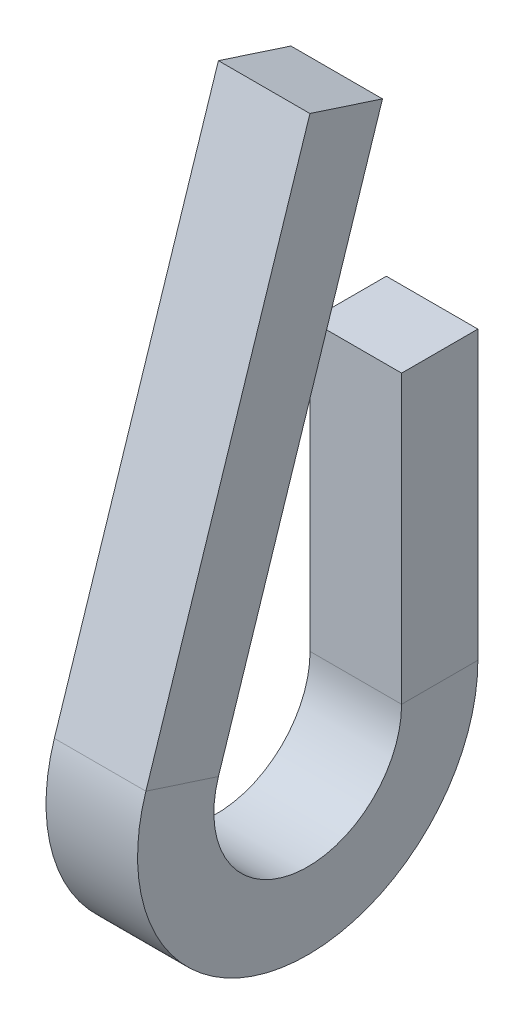
ISO-10303-21;
HEADER;
FILE_DESCRIPTION(('STEP AP214'),'2;1');
FILE_NAME('part.step','',(''),(''),'','','');
FILE_SCHEMA(('AUTOMOTIVE_DESIGN { 1 0 10303 214 1 1 1 1 }'));
ENDSEC;
DATA;
#1=APPLICATION_CONTEXT('core data for automotive mechanical design processes');
#2=APPLICATION_PROTOCOL_DEFINITION('international standard','automotive_design',2000,#1);
#3=PRODUCT_CONTEXT('',#1,'mechanical');
#4=PRODUCT('Part','Part','',(#3));
#5=PRODUCT_RELATED_PRODUCT_CATEGORY('part','',(#4));
#6=PRODUCT_DEFINITION_FORMATION('','',#4);
#7=PRODUCT_DEFINITION_CONTEXT('part definition',#1,'design');
#8=PRODUCT_DEFINITION('design','',#6,#7);
#9=PRODUCT_DEFINITION_SHAPE('','',#8);
#10=(LENGTH_UNIT() NAMED_UNIT(*) SI_UNIT(.MILLI.,.METRE.));
#11=(NAMED_UNIT(*) PLANE_ANGLE_UNIT() SI_UNIT($,.RADIAN.));
#12=(NAMED_UNIT(*) SI_UNIT($,.STERADIAN.) SOLID_ANGLE_UNIT());
#13=UNCERTAINTY_MEASURE_WITH_UNIT(LENGTH_MEASURE(1.E-05),#10,'distance_accuracy_value','');
#14=(GEOMETRIC_REPRESENTATION_CONTEXT(3) GLOBAL_UNCERTAINTY_ASSIGNED_CONTEXT((#13)) GLOBAL_UNIT_ASSIGNED_CONTEXT((#10,
#11,#12)) REPRESENTATION_CONTEXT('',''));
#15=CARTESIAN_POINT('',(0.,0.,0.));
#16=DIRECTION('',(0.,0.,1.));
#17=DIRECTION('',(1.,0.,0.));
#18=AXIS2_PLACEMENT_3D('',#15,#16,#17);
#19=CARTESIAN_POINT('',(0.,0.,0.));
#20=DIRECTION('',(0.,-1.,0.));
#21=DIRECTION('',(0.,0.,-1.));
#22=AXIS2_PLACEMENT_3D('',#19,#20,#21);
#23=PLANE('',#22);
#24=DIRECTION('',(0.,0.,-1.));
#25=VECTOR('',#24,1.);
#26=CARTESIAN_POINT('',(6.,0.,5.));
#27=LINE('',#26,#25);
#28=CARTESIAN_POINT('',(6.,0.,5.));
#29=VERTEX_POINT('',#28);
#30=CARTESIAN_POINT('',(6.,0.,-5.));
#31=VERTEX_POINT('',#30);
#32=EDGE_CURVE('E146',#29,#31,#27,.T.);
#33=ORIENTED_EDGE('',*,*,#32,.T.);
#34=DIRECTION('',(-1.,0.,0.));
#35=VECTOR('',#34,1.);
#36=CARTESIAN_POINT('',(-6.,0.,-5.));
#37=LINE('',#36,#35);
#38=CARTESIAN_POINT('',(-6.,0.,-5.));
#39=VERTEX_POINT('',#38);
#40=EDGE_CURVE('E157',#31,#39,#37,.T.);
#41=ORIENTED_EDGE('',*,*,#40,.T.);
#42=DIRECTION('',(0.,0.,1.));
#43=VECTOR('',#42,1.);
#44=CARTESIAN_POINT('',(-6.,0.,5.));
#45=LINE('',#44,#43);
#46=CARTESIAN_POINT('',(-6.,0.,5.));
#47=VERTEX_POINT('',#46);
#48=EDGE_CURVE('E161',#39,#47,#45,.T.);
#49=ORIENTED_EDGE('',*,*,#48,.T.);
#50=DIRECTION('',(1.,0.,0.));
#51=VECTOR('',#50,1.);
#52=CARTESIAN_POINT('',(-6.,0.,5.));
#53=LINE('',#52,#51);
#54=EDGE_CURVE('E160',#47,#29,#53,.T.);
#55=ORIENTED_EDGE('',*,*,#54,.T.);
#56=EDGE_LOOP('',(#33,#41,#49,#55));
#57=FACE_BOUND('',#56,.T.);
#58=ADVANCED_FACE('F43',(#57),#23,.F.);
#59=CARTESIAN_POINT('',(0.,33.9359199934688,12.2630312393681));
#60=DIRECTION('',(0.,0.951056516295218,-0.309016994374749));
#61=DIRECTION('',(0.,0.309016994374749,0.951056516295218));
#62=AXIS2_PLACEMENT_3D('',#59,#60,#61);
#63=PLANE('',#62);
#64=DIRECTION('',(0.,0.309016994374749,0.951056516295218));
#65=VECTOR('',#64,1.);
#66=CARTESIAN_POINT('',(6.,32.390835021595,7.50774865789199));
#67=LINE('',#66,#65);
#68=CARTESIAN_POINT('',(6.,32.390835021595,7.507748657892));
#69=VERTEX_POINT('',#68);
#70=CARTESIAN_POINT('',(6.,35.4810049653425,17.0183138208442));
#71=VERTEX_POINT('',#70);
#72=EDGE_CURVE('E260',#69,#71,#67,.T.);
#73=ORIENTED_EDGE('',*,*,#72,.F.);
#74=DIRECTION('',(1.,0.,0.));
#75=VECTOR('',#74,1.);
#76=CARTESIAN_POINT('',(-6.,32.390835021595,7.50774865789199));
#77=LINE('',#76,#75);
#78=CARTESIAN_POINT('',(-6.,32.390835021595,7.507748657892));
#79=VERTEX_POINT('',#78);
#80=EDGE_CURVE('E12',#79,#69,#77,.T.);
#81=ORIENTED_EDGE('',*,*,#80,.F.);
#82=DIRECTION('',(0.,-0.309016994374749,-0.951056516295218));
#83=VECTOR('',#82,1.);
#84=CARTESIAN_POINT('',(-6.,32.390835021595,7.50774865789199));
#85=LINE('',#84,#83);
#86=CARTESIAN_POINT('',(-6.,35.4810049653425,17.0183138208442));
#87=VERTEX_POINT('',#86);
#88=EDGE_CURVE('E63',#87,#79,#85,.T.);
#89=ORIENTED_EDGE('',*,*,#88,.F.);
#90=DIRECTION('',(-1.,0.,0.));
#91=VECTOR('',#90,1.);
#92=CARTESIAN_POINT('',(-6.,35.4810049653425,17.0183138208442));
#93=LINE('',#92,#91);
#94=EDGE_CURVE('E73',#71,#87,#93,.T.);
#95=ORIENTED_EDGE('',*,*,#94,.F.);
#96=EDGE_LOOP('',(#73,#81,#89,#95));
#97=FACE_BOUND('',#96,.T.);
#98=ADVANCED_FACE('F300',(#97),#63,.T.);
#99=CARTESIAN_POINT('',(6.,0.,5.));
#100=DIRECTION('',(-1.,0.,0.));
#101=DIRECTION('',(0.,0.,1.));
#102=AXIS2_PLACEMENT_3D('',#99,#100,#101);
#103=PLANE('',#102);
#104=DIRECTION('',(0.,-1.,0.));
#105=VECTOR('',#104,1.);
#106=CARTESIAN_POINT('',(6.,0.,-5.));
#107=LINE('',#106,#105);
#108=CARTESIAN_POINT('',(6.,-37.5978864707488,-5.));
#109=VERTEX_POINT('',#108);
#110=EDGE_CURVE('E153',#31,#109,#107,.T.);
#111=ORIENTED_EDGE('',*,*,#110,.F.);
#112=ORIENTED_EDGE('',*,*,#32,.F.);
#113=DIRECTION('',(0.,-1.,0.));
#114=VECTOR('',#113,1.);
#115=CARTESIAN_POINT('',(6.,0.,5.));
#116=LINE('',#115,#114);
#117=CARTESIAN_POINT('',(6.,-37.5978864707488,5.));
#118=VERTEX_POINT('',#117);
#119=EDGE_CURVE('E151',#29,#118,#116,.T.);
#120=ORIENTED_EDGE('',*,*,#119,.T.);
#121=DIRECTION('',(0.,0.,-1.));
#122=VECTOR('',#121,1.);
#123=CARTESIAN_POINT('',(6.,-37.5978864707488,5.));
#124=LINE('',#123,#122);
#125=EDGE_CURVE('E172',#118,#109,#124,.T.);
#126=ORIENTED_EDGE('',*,*,#125,.T.);
#127=EDGE_LOOP('',(#111,#112,#120,#126));
#128=FACE_BOUND('',#127,.T.);
#129=ADVANCED_FACE('F148',(#128),#103,.F.);
#130=CARTESIAN_POINT('',(-6.,0.,-5.));
#131=DIRECTION('',(0.,0.,1.));
#132=DIRECTION('',(1.,0.,0.));
#133=AXIS2_PLACEMENT_3D('',#130,#131,#132);
#134=PLANE('',#133);
#135=DIRECTION('',(0.,-1.,0.));
#136=VECTOR('',#135,1.);
#137=CARTESIAN_POINT('',(-6.,0.,-5.));
#138=LINE('',#137,#136);
#139=CARTESIAN_POINT('',(-6.,-37.5978864707488,-5.));
#140=VERTEX_POINT('',#139);
#141=EDGE_CURVE('E212',#39,#140,#138,.T.);
#142=ORIENTED_EDGE('',*,*,#141,.F.);
#143=ORIENTED_EDGE('',*,*,#40,.F.);
#144=ORIENTED_EDGE('',*,*,#110,.T.);
#145=DIRECTION('',(-1.,0.,0.));
#146=VECTOR('',#145,1.);
#147=CARTESIAN_POINT('',(-6.,-37.5978864707488,-5.));
#148=LINE('',#147,#146);
#149=EDGE_CURVE('E208',#109,#140,#148,.T.);
#150=ORIENTED_EDGE('',*,*,#149,.T.);
#151=EDGE_LOOP('',(#142,#143,#144,#150));
#152=FACE_BOUND('',#151,.T.);
#153=ADVANCED_FACE('F291',(#152),#134,.F.);
#154=CARTESIAN_POINT('',(-6.,0.,5.));
#155=DIRECTION('',(1.,0.,0.));
#156=DIRECTION('',(0.,0.,-1.));
#157=AXIS2_PLACEMENT_3D('',#154,#155,#156);
#158=PLANE('',#157);
#159=DIRECTION('',(0.,-1.,0.));
#160=VECTOR('',#159,1.);
#161=CARTESIAN_POINT('',(-6.,0.,5.));
#162=LINE('',#161,#160);
#163=CARTESIAN_POINT('',(-6.,-37.5978864707488,5.));
#164=VERTEX_POINT('',#163);
#165=EDGE_CURVE('E220',#47,#164,#162,.T.);
#166=ORIENTED_EDGE('',*,*,#165,.F.);
#167=ORIENTED_EDGE('',*,*,#48,.F.);
#168=ORIENTED_EDGE('',*,*,#141,.T.);
#169=DIRECTION('',(0.,0.,1.));
#170=VECTOR('',#169,1.);
#171=CARTESIAN_POINT('',(-6.,-37.5978864707488,5.));
#172=LINE('',#171,#170);
#173=EDGE_CURVE('E224',#140,#164,#172,.T.);
#174=ORIENTED_EDGE('',*,*,#173,.T.);
#175=EDGE_LOOP('',(#166,#167,#168,#174));
#176=FACE_BOUND('',#175,.T.);
#177=ADVANCED_FACE('F349',(#176),#158,.F.);
#178=CARTESIAN_POINT('',(-6.,0.,5.));
#179=DIRECTION('',(0.,0.,-1.));
#180=DIRECTION('',(-1.,0.,0.));
#181=AXIS2_PLACEMENT_3D('',#178,#179,#180);
#182=PLANE('',#181);
#183=DIRECTION('',(1.,0.,0.));
#184=VECTOR('',#183,1.);
#185=CARTESIAN_POINT('',(-6.,-37.5978864707488,5.));
#186=LINE('',#185,#184);
#187=EDGE_CURVE('E170',#164,#118,#186,.T.);
#188=ORIENTED_EDGE('',*,*,#187,.T.);
#189=ORIENTED_EDGE('',*,*,#119,.F.);
#190=ORIENTED_EDGE('',*,*,#54,.F.);
#191=ORIENTED_EDGE('',*,*,#165,.T.);
#192=EDGE_LOOP('',(#188,#189,#190,#191));
#193=FACE_BOUND('',#192,.T.);
#194=ADVANCED_FACE('F168',(#193),#182,.F.);
#195=CARTESIAN_POINT('',(6.,-37.5978864707488,5.00000000000002));
#196=DIRECTION('',(-1.,0.,0.));
#197=DIRECTION('',(0.,0.,1.));
#198=AXIS2_PLACEMENT_3D('',#195,#196,#197);
#199=PLANE('',#198);
#200=CARTESIAN_POINT('',(6.,-37.5978864707488,17.3075445828761));
#201=DIRECTION('',(-1.,0.,0.));
#202=DIRECTION('',(0.,0.,-1.));
#203=AXIS2_PLACEMENT_3D('',#200,#201,#202);
#204=CIRCLE('',#203,22.3075445828761);
#205=CARTESIAN_POINT('',(6.,-30.7044760918677,38.5232802209665));
#206=VERTEX_POINT('',#205);
#207=EDGE_CURVE('E133',#109,#206,#204,.T.);
#208=ORIENTED_EDGE('',*,*,#207,.F.);
#209=ORIENTED_EDGE('',*,*,#125,.F.);
#210=CARTESIAN_POINT('',(6.,-37.5978864707488,17.3075445828761));
#211=DIRECTION('',(-1.,0.,0.));
#212=DIRECTION('',(0.,0.,-1.));
#213=AXIS2_PLACEMENT_3D('',#210,#211,#212);
#214=CIRCLE('',#213,12.3075445828761);
#215=CARTESIAN_POINT('',(6.,-33.7946460356152,29.0127150580143));
#216=VERTEX_POINT('',#215);
#217=EDGE_CURVE('E247',#118,#216,#214,.T.);
#218=ORIENTED_EDGE('',*,*,#217,.T.);
#219=DIRECTION('',(0.,0.30901699437475,0.951056516295218));
#220=VECTOR('',#219,1.);
#221=CARTESIAN_POINT('',(6.,-33.7946460356152,29.0127150580143));
#222=LINE('',#221,#220);
#223=EDGE_CURVE('E181',#216,#206,#222,.T.);
#224=ORIENTED_EDGE('',*,*,#223,.T.);
#225=EDGE_LOOP('',(#208,#209,#218,#224));
#226=FACE_BOUND('',#225,.T.);
#227=ADVANCED_FACE('F292',(#226),#199,.F.);
#228=CARTESIAN_POINT('',(0.,-37.5978864707488,17.3075445828761));
#229=DIRECTION('',(-1.,0.,0.));
#230=DIRECTION('',(0.,0.,1.));
#231=AXIS2_PLACEMENT_3D('',#228,#229,#230);
#232=CYLINDRICAL_SURFACE('',#231,22.3075445828761);
#233=CARTESIAN_POINT('',(-6.,-37.5978864707488,17.3075445828761));
#234=DIRECTION('',(-1.,0.,0.));
#235=DIRECTION('',(0.,0.,-1.));
#236=AXIS2_PLACEMENT_3D('',#233,#234,#235);
#237=CIRCLE('',#236,22.3075445828761);
#238=CARTESIAN_POINT('',(-6.,-30.7044760918677,38.5232802209665));
#239=VERTEX_POINT('',#238);
#240=EDGE_CURVE('E125',#140,#239,#237,.T.);
#241=ORIENTED_EDGE('',*,*,#240,.F.);
#242=ORIENTED_EDGE('',*,*,#149,.F.);
#243=ORIENTED_EDGE('',*,*,#207,.T.);
#244=DIRECTION('',(-1.,0.,0.));
#245=VECTOR('',#244,1.);
#246=CARTESIAN_POINT('',(-6.,-30.7044760918677,38.5232802209665));
#247=LINE('',#246,#245);
#248=EDGE_CURVE('E255',#206,#239,#247,.T.);
#249=ORIENTED_EDGE('',*,*,#248,.T.);
#250=EDGE_LOOP('',(#241,#242,#243,#249));
#251=FACE_BOUND('',#250,.T.);
#252=ADVANCED_FACE('F302',(#251),#232,.T.);
#253=CARTESIAN_POINT('',(-6.,-37.5978864707488,5.00000000000002));
#254=DIRECTION('',(1.,0.,0.));
#255=DIRECTION('',(0.,0.,-1.));
#256=AXIS2_PLACEMENT_3D('',#253,#254,#255);
#257=PLANE('',#256);
#258=CARTESIAN_POINT('',(-6.,-37.5978864707488,17.3075445828761));
#259=DIRECTION('',(-1.,0.,0.));
#260=DIRECTION('',(0.,0.,-1.));
#261=AXIS2_PLACEMENT_3D('',#258,#259,#260);
#262=CIRCLE('',#261,12.3075445828761);
#263=CARTESIAN_POINT('',(-6.,-33.7946460356152,29.0127150580143));
#264=VERTEX_POINT('',#263);
#265=EDGE_CURVE('E231',#164,#264,#262,.T.);
#266=ORIENTED_EDGE('',*,*,#265,.F.);
#267=ORIENTED_EDGE('',*,*,#173,.F.);
#268=ORIENTED_EDGE('',*,*,#240,.T.);
#269=DIRECTION('',(0.,-0.30901699437475,-0.951056516295218));
#270=VECTOR('',#269,1.);
#271=CARTESIAN_POINT('',(-6.,-33.7946460356152,29.0127150580143));
#272=LINE('',#271,#270);
#273=EDGE_CURVE('E226',#239,#264,#272,.T.);
#274=ORIENTED_EDGE('',*,*,#273,.T.);
#275=EDGE_LOOP('',(#266,#267,#268,#274));
#276=FACE_BOUND('',#275,.T.);
#277=ADVANCED_FACE('F280',(#276),#257,.F.);
#278=CARTESIAN_POINT('',(0.,-37.5978864707488,17.3075445828761));
#279=DIRECTION('',(-1.,0.,0.));
#280=DIRECTION('',(0.,0.,1.));
#281=AXIS2_PLACEMENT_3D('',#278,#279,#280);
#282=CYLINDRICAL_SURFACE('',#281,12.3075445828761);
#283=DIRECTION('',(1.,0.,0.));
#284=VECTOR('',#283,1.);
#285=CARTESIAN_POINT('',(-6.,-33.7946460356152,29.0127150580143));
#286=LINE('',#285,#284);
#287=EDGE_CURVE('E240',#264,#216,#286,.T.);
#288=ORIENTED_EDGE('',*,*,#287,.T.);
#289=ORIENTED_EDGE('',*,*,#217,.F.);
#290=ORIENTED_EDGE('',*,*,#187,.F.);
#291=ORIENTED_EDGE('',*,*,#265,.T.);
#292=EDGE_LOOP('',(#288,#289,#290,#291));
#293=FACE_BOUND('',#292,.T.);
#294=ADVANCED_FACE('F277',(#293),#282,.F.);
#295=CARTESIAN_POINT('',(6.,-33.7946460356152,29.0127150580143));
#296=DIRECTION('',(-1.,0.,0.));
#297=DIRECTION('',(0.,0.,1.));
#298=AXIS2_PLACEMENT_3D('',#295,#296,#297);
#299=PLANE('',#298);
#300=DIRECTION('',(0.,0.951056516295218,-0.309016994374749));
#301=VECTOR('',#300,1.);
#302=CARTESIAN_POINT('',(6.,-30.7044760918677,38.5232802209665));
#303=LINE('',#302,#301);
#304=EDGE_CURVE('E109',#206,#71,#303,.T.);
#305=ORIENTED_EDGE('',*,*,#304,.F.);
#306=ORIENTED_EDGE('',*,*,#223,.F.);
#307=DIRECTION('',(0.,0.951056516295218,-0.309016994374749));
#308=VECTOR('',#307,1.);
#309=CARTESIAN_POINT('',(6.,-33.7946460356152,29.0127150580143));
#310=LINE('',#309,#308);
#311=EDGE_CURVE('E205',#216,#69,#310,.T.);
#312=ORIENTED_EDGE('',*,*,#311,.T.);
#313=ORIENTED_EDGE('',*,*,#72,.T.);
#314=EDGE_LOOP('',(#305,#306,#312,#313));
#315=FACE_BOUND('',#314,.T.);
#316=ADVANCED_FACE('F298',(#315),#299,.F.);
#317=CARTESIAN_POINT('',(-6.,-30.7044760918677,38.5232802209665));
#318=DIRECTION('',(0.,-0.309016994374749,-0.951056516295218));
#319=DIRECTION('',(0.,0.951056516295218,-0.309016994374749));
#320=AXIS2_PLACEMENT_3D('',#317,#318,#319);
#321=PLANE('',#320);
#322=DIRECTION('',(0.,0.951056516295218,-0.309016994374749));
#323=VECTOR('',#322,1.);
#324=CARTESIAN_POINT('',(-6.,-30.7044760918677,38.5232802209665));
#325=LINE('',#324,#323);
#326=EDGE_CURVE('E103',#239,#87,#325,.T.);
#327=ORIENTED_EDGE('',*,*,#326,.F.);
#328=ORIENTED_EDGE('',*,*,#248,.F.);
#329=ORIENTED_EDGE('',*,*,#304,.T.);
#330=ORIENTED_EDGE('',*,*,#94,.T.);
#331=EDGE_LOOP('',(#327,#328,#329,#330));
#332=FACE_BOUND('',#331,.T.);
#333=ADVANCED_FACE('F301',(#332),#321,.F.);
#334=CARTESIAN_POINT('',(-6.,-33.7946460356152,29.0127150580143));
#335=DIRECTION('',(1.,0.,0.));
#336=DIRECTION('',(0.,0.,-1.));
#337=AXIS2_PLACEMENT_3D('',#334,#335,#336);
#338=PLANE('',#337);
#339=DIRECTION('',(0.,0.951056516295218,-0.309016994374749));
#340=VECTOR('',#339,1.);
#341=CARTESIAN_POINT('',(-6.,-33.7946460356152,29.0127150580143));
#342=LINE('',#341,#340);
#343=EDGE_CURVE('E53',#264,#79,#342,.T.);
#344=ORIENTED_EDGE('',*,*,#343,.F.);
#345=ORIENTED_EDGE('',*,*,#273,.F.);
#346=ORIENTED_EDGE('',*,*,#326,.T.);
#347=ORIENTED_EDGE('',*,*,#88,.T.);
#348=EDGE_LOOP('',(#344,#345,#346,#347));
#349=FACE_BOUND('',#348,.T.);
#350=ADVANCED_FACE('F281',(#349),#338,.F.);
#351=CARTESIAN_POINT('',(-6.,-33.7946460356152,29.0127150580143));
#352=DIRECTION('',(0.,0.309016994374749,0.951056516295218));
#353=DIRECTION('',(0.,-0.951056516295218,0.309016994374749));
#354=AXIS2_PLACEMENT_3D('',#351,#352,#353);
#355=PLANE('',#354);
#356=ORIENTED_EDGE('',*,*,#80,.T.);
#357=ORIENTED_EDGE('',*,*,#311,.F.);
#358=ORIENTED_EDGE('',*,*,#287,.F.);
#359=ORIENTED_EDGE('',*,*,#343,.T.);
#360=EDGE_LOOP('',(#356,#357,#358,#359));
#361=FACE_BOUND('',#360,.T.);
#362=ADVANCED_FACE('F272',(#361),#355,.F.);
#363=CLOSED_SHELL('',(#58,#98,#129,#153,#177,#194,#227,#252,#277,#294,#316,#333,#350,#362));
#364=MANIFOLD_SOLID_BREP('B2',#363);
#365=ADVANCED_BREP_SHAPE_REPRESENTATION('',(#18,#364),#14);
#366=SHAPE_DEFINITION_REPRESENTATION(#9,#365);
ENDSEC;
END-ISO-10303-21;
